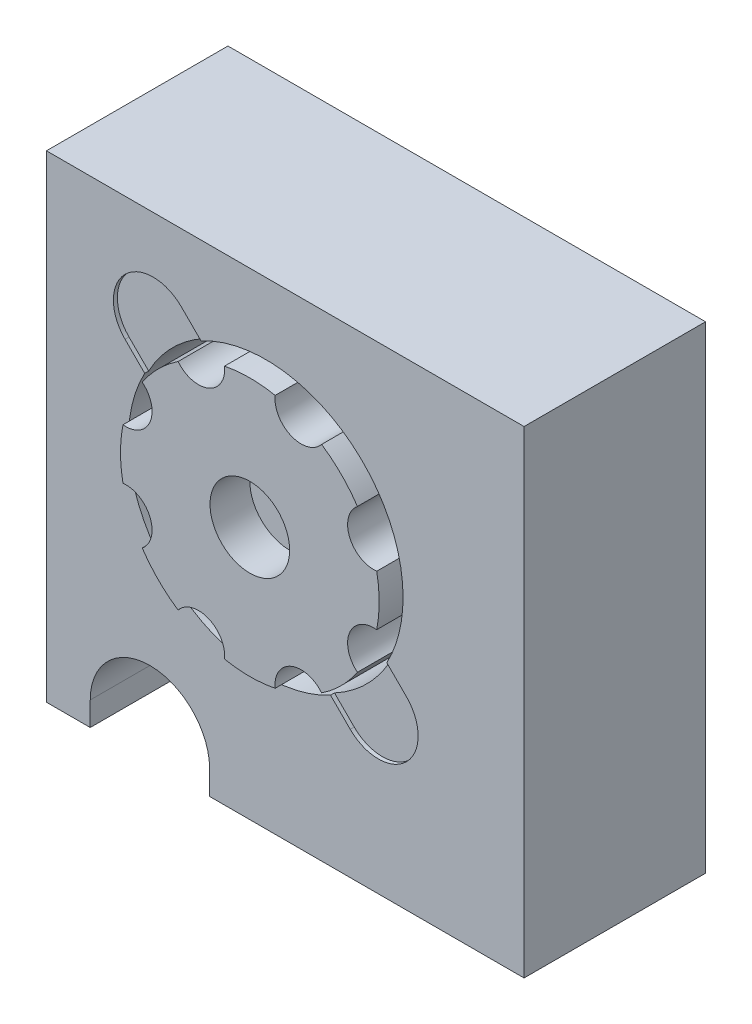
ISO-10303-21;
HEADER;
FILE_DESCRIPTION(('STEP AP214'),'2;1');
FILE_NAME('part.step','',(''),(''),'','','');
FILE_SCHEMA(('AUTOMOTIVE_DESIGN { 1 0 10303 214 1 1 1 1 }'));
ENDSEC;
DATA;
#1=APPLICATION_CONTEXT('core data for automotive mechanical design processes');
#2=APPLICATION_PROTOCOL_DEFINITION('international standard','automotive_design',2000,#1);
#3=PRODUCT_CONTEXT('',#1,'mechanical');
#4=PRODUCT('Part','Part','',(#3));
#5=PRODUCT_RELATED_PRODUCT_CATEGORY('part','',(#4));
#6=PRODUCT_DEFINITION_FORMATION('','',#4);
#7=PRODUCT_DEFINITION_CONTEXT('part definition',#1,'design');
#8=PRODUCT_DEFINITION('design','',#6,#7);
#9=PRODUCT_DEFINITION_SHAPE('','',#8);
#10=(LENGTH_UNIT() NAMED_UNIT(*) SI_UNIT(.MILLI.,.METRE.));
#11=(NAMED_UNIT(*) PLANE_ANGLE_UNIT() SI_UNIT($,.RADIAN.));
#12=(NAMED_UNIT(*) SI_UNIT($,.STERADIAN.) SOLID_ANGLE_UNIT());
#13=UNCERTAINTY_MEASURE_WITH_UNIT(LENGTH_MEASURE(1.E-05),#10,'distance_accuracy_value','');
#14=(GEOMETRIC_REPRESENTATION_CONTEXT(3) GLOBAL_UNCERTAINTY_ASSIGNED_CONTEXT((#13)) GLOBAL_UNIT_ASSIGNED_CONTEXT((#10,
#11,#12)) REPRESENTATION_CONTEXT('',''));
#15=CARTESIAN_POINT('',(0.,0.,0.));
#16=DIRECTION('',(0.,0.,1.));
#17=DIRECTION('',(1.,0.,0.));
#18=AXIS2_PLACEMENT_3D('',#15,#16,#17);
#19=CARTESIAN_POINT('',(-0.244999999999999,0.382,2.48));
#20=DIRECTION('',(0.,0.,-1.));
#21=DIRECTION('',(-1.,0.,0.));
#22=AXIS2_PLACEMENT_3D('',#19,#20,#21);
#23=CYLINDRICAL_SURFACE('',#22,1.625);
#24=CARTESIAN_POINT('',(-0.244999999999999,0.382,1.28));
#25=DIRECTION('',(0.,0.,1.));
#26=DIRECTION('',(1.,0.,0.));
#27=AXIS2_PLACEMENT_3D('',#24,#25,#26);
#28=CIRCLE('',#27,1.625);
#29=CARTESIAN_POINT('',(1.34854429100551,0.063815159688981,1.28));
#30=VERTEX_POINT('',#29);
#31=CARTESIAN_POINT('',(1.34854429100551,0.700184840311017,1.28));
#32=VERTEX_POINT('',#31);
#33=EDGE_CURVE('E273',#30,#32,#28,.T.);
#34=ORIENTED_EDGE('',*,*,#33,.T.);
#35=DIRECTION('',(0.,0.,1.));
#36=VECTOR('',#35,1.);
#37=CARTESIAN_POINT('',(1.34854429100551,0.700184840311017,1.88));
#38=LINE('',#37,#36);
#39=CARTESIAN_POINT('',(1.34854429100551,0.700184840311017,2.48));
#40=VERTEX_POINT('',#39);
#41=EDGE_CURVE('E282',#32,#40,#38,.T.);
#42=ORIENTED_EDGE('',*,*,#41,.T.);
#43=CARTESIAN_POINT('',(-0.244999999999999,0.382,2.48));
#44=DIRECTION('',(0.,0.,1.));
#45=DIRECTION('',(1.,0.,0.));
#46=AXIS2_PLACEMENT_3D('',#43,#44,#45);
#47=CIRCLE('',#46,1.625);
#48=CARTESIAN_POINT('',(1.34854429100551,0.0638151596889812,2.48));
#49=VERTEX_POINT('',#48);
#50=EDGE_CURVE('E271',#49,#40,#47,.T.);
#51=ORIENTED_EDGE('',*,*,#50,.F.);
#52=DIRECTION('',(0.,0.,1.));
#53=VECTOR('',#52,1.);
#54=CARTESIAN_POINT('',(1.34854429100551,0.063815159688981,1.88));
#55=LINE('',#54,#53);
#56=EDGE_CURVE('E50',#49,#30,#55,.F.);
#57=ORIENTED_EDGE('',*,*,#56,.T.);
#58=EDGE_LOOP('',(#34,#42,#51,#57));
#59=FACE_BOUND('',#58,.T.);
#60=ADVANCED_FACE('F35',(#59),#23,.T.);
#61=CARTESIAN_POINT('',(0.656815316036428,-0.969796632545783,1.28));
#62=VERTEX_POINT('',#61);
#63=CARTESIAN_POINT('',(1.10679663254579,-0.519815316036425,1.28));
#64=VERTEX_POINT('',#63);
#65=EDGE_CURVE('E281',#62,#64,#28,.T.);
#66=ORIENTED_EDGE('',*,*,#65,.T.);
#67=DIRECTION('',(0.,0.,1.));
#68=VECTOR('',#67,1.);
#69=CARTESIAN_POINT('',(1.10679663254579,-0.519815316036425,1.88));
#70=LINE('',#69,#68);
#71=CARTESIAN_POINT('',(1.10679663254579,-0.519815316036425,2.48));
#72=VERTEX_POINT('',#71);
#73=EDGE_CURVE('E290',#64,#72,#70,.T.);
#74=ORIENTED_EDGE('',*,*,#73,.T.);
#75=CARTESIAN_POINT('',(0.656815316036429,-0.969796632545782,2.48));
#76=VERTEX_POINT('',#75);
#77=EDGE_CURVE('E275',#76,#72,#47,.T.);
#78=ORIENTED_EDGE('',*,*,#77,.F.);
#79=DIRECTION('',(0.,0.,1.));
#80=VECTOR('',#79,1.);
#81=CARTESIAN_POINT('',(0.656815316036428,-0.969796632545783,1.88));
#82=LINE('',#81,#80);
#83=EDGE_CURVE('E58',#76,#62,#82,.F.);
#84=ORIENTED_EDGE('',*,*,#83,.T.);
#85=EDGE_LOOP('',(#66,#74,#78,#84));
#86=FACE_BOUND('',#85,.T.);
#87=ADVANCED_FACE('F385',(#86),#23,.T.);
#88=CARTESIAN_POINT('',(-0.563184840311004,-1.21154429100551,1.28));
#89=VERTEX_POINT('',#88);
#90=CARTESIAN_POINT('',(0.073184840311017,-1.21154429100551,1.28));
#91=VERTEX_POINT('',#90);
#92=EDGE_CURVE('E287',#89,#91,#28,.T.);
#93=ORIENTED_EDGE('',*,*,#92,.T.);
#94=DIRECTION('',(0.,0.,1.));
#95=VECTOR('',#94,1.);
#96=CARTESIAN_POINT('',(0.0731848403110171,-1.21154429100551,1.88));
#97=LINE('',#96,#95);
#98=CARTESIAN_POINT('',(0.0731848403110171,-1.21154429100551,2.48));
#99=VERTEX_POINT('',#98);
#100=EDGE_CURVE('E296',#91,#99,#97,.T.);
#101=ORIENTED_EDGE('',*,*,#100,.T.);
#102=CARTESIAN_POINT('',(-0.563184840311004,-1.21154429100551,2.48));
#103=VERTEX_POINT('',#102);
#104=EDGE_CURVE('E376',#103,#99,#47,.T.);
#105=ORIENTED_EDGE('',*,*,#104,.F.);
#106=DIRECTION('',(0.,0.,1.));
#107=VECTOR('',#106,1.);
#108=CARTESIAN_POINT('',(-0.563184840311004,-1.21154429100551,1.88));
#109=LINE('',#108,#107);
#110=EDGE_CURVE('E303',#103,#89,#109,.F.);
#111=ORIENTED_EDGE('',*,*,#110,.T.);
#112=EDGE_LOOP('',(#93,#101,#105,#111));
#113=FACE_BOUND('',#112,.T.);
#114=ADVANCED_FACE('F403',(#113),#23,.T.);
#115=CARTESIAN_POINT('',(-1.59679663254578,-0.519815316036427,1.28));
#116=VERTEX_POINT('',#115);
#117=CARTESIAN_POINT('',(-1.14681531603643,-0.969796632545782,1.28));
#118=VERTEX_POINT('',#117);
#119=EDGE_CURVE('E443',#116,#118,#28,.T.);
#120=ORIENTED_EDGE('',*,*,#119,.T.);
#121=DIRECTION('',(0.,0.,1.));
#122=VECTOR('',#121,1.);
#123=CARTESIAN_POINT('',(-1.14681531603643,-0.969796632545781,1.88));
#124=LINE('',#123,#122);
#125=CARTESIAN_POINT('',(-1.14681531603643,-0.969796632545781,2.48));
#126=VERTEX_POINT('',#125);
#127=EDGE_CURVE('E300',#118,#126,#124,.T.);
#128=ORIENTED_EDGE('',*,*,#127,.T.);
#129=CARTESIAN_POINT('',(-1.59679663254578,-0.519815316036428,2.48));
#130=VERTEX_POINT('',#129);
#131=EDGE_CURVE('E372',#130,#126,#47,.T.);
#132=ORIENTED_EDGE('',*,*,#131,.F.);
#133=DIRECTION('',(0.,0.,1.));
#134=VECTOR('',#133,1.);
#135=CARTESIAN_POINT('',(-1.59679663254578,-0.519815316036427,1.88));
#136=LINE('',#135,#134);
#137=EDGE_CURVE('E309',#130,#116,#136,.F.);
#138=ORIENTED_EDGE('',*,*,#137,.T.);
#139=EDGE_LOOP('',(#120,#128,#132,#138));
#140=FACE_BOUND('',#139,.T.);
#141=ADVANCED_FACE('F461',(#140),#23,.T.);
#142=CARTESIAN_POINT('',(-1.83854429100551,0.700184840311017,1.28));
#143=VERTEX_POINT('',#142);
#144=CARTESIAN_POINT('',(-1.83854429100551,0.0638151596889833,1.28));
#145=VERTEX_POINT('',#144);
#146=EDGE_CURVE('E445',#143,#145,#28,.T.);
#147=ORIENTED_EDGE('',*,*,#146,.T.);
#148=DIRECTION('',(0.,0.,1.));
#149=VECTOR('',#148,1.);
#150=CARTESIAN_POINT('',(-1.83854429100551,0.0638151596889833,1.88));
#151=LINE('',#150,#149);
#152=CARTESIAN_POINT('',(-1.83854429100551,0.0638151596889833,2.48));
#153=VERTEX_POINT('',#152);
#154=EDGE_CURVE('E306',#145,#153,#151,.T.);
#155=ORIENTED_EDGE('',*,*,#154,.T.);
#156=CARTESIAN_POINT('',(-1.83854429100551,0.700184840311017,2.48));
#157=VERTEX_POINT('',#156);
#158=EDGE_CURVE('E368',#157,#153,#47,.T.);
#159=ORIENTED_EDGE('',*,*,#158,.F.);
#160=DIRECTION('',(0.,0.,1.));
#161=VECTOR('',#160,1.);
#162=CARTESIAN_POINT('',(-1.83854429100551,0.700184840311017,1.88));
#163=LINE('',#162,#161);
#164=EDGE_CURVE('E315',#157,#143,#163,.F.);
#165=ORIENTED_EDGE('',*,*,#164,.T.);
#166=EDGE_LOOP('',(#147,#155,#159,#165));
#167=FACE_BOUND('',#166,.T.);
#168=ADVANCED_FACE('F422',(#167),#23,.T.);
#169=CARTESIAN_POINT('',(-1.14681531603643,1.73379663254578,1.28));
#170=VERTEX_POINT('',#169);
#171=CARTESIAN_POINT('',(-1.59679663254578,1.28381531603643,1.28));
#172=VERTEX_POINT('',#171);
#173=EDGE_CURVE('E278',#170,#172,#28,.T.);
#174=ORIENTED_EDGE('',*,*,#173,.T.);
#175=DIRECTION('',(0.,0.,1.));
#176=VECTOR('',#175,1.);
#177=CARTESIAN_POINT('',(-1.59679663254578,1.28381531603643,1.88));
#178=LINE('',#177,#176);
#179=CARTESIAN_POINT('',(-1.59679663254578,1.28381531603643,2.48));
#180=VERTEX_POINT('',#179);
#181=EDGE_CURVE('E312',#172,#180,#178,.T.);
#182=ORIENTED_EDGE('',*,*,#181,.T.);
#183=CARTESIAN_POINT('',(-1.14681531603643,1.73379663254578,2.48));
#184=VERTEX_POINT('',#183);
#185=EDGE_CURVE('E364',#184,#180,#47,.T.);
#186=ORIENTED_EDGE('',*,*,#185,.F.);
#187=DIRECTION('',(0.,0.,1.));
#188=VECTOR('',#187,1.);
#189=CARTESIAN_POINT('',(-1.14681531603643,1.73379663254578,1.88));
#190=LINE('',#189,#188);
#191=EDGE_CURVE('E253',#184,#170,#190,.F.);
#192=ORIENTED_EDGE('',*,*,#191,.T.);
#193=EDGE_LOOP('',(#174,#182,#186,#192));
#194=FACE_BOUND('',#193,.T.);
#195=ADVANCED_FACE('F414',(#194),#23,.T.);
#196=CARTESIAN_POINT('',(0.0731848403110171,1.97554429100551,1.28));
#197=VERTEX_POINT('',#196);
#198=CARTESIAN_POINT('',(-0.563184840311016,1.97554429100551,1.28));
#199=VERTEX_POINT('',#198);
#200=EDGE_CURVE('E265',#197,#199,#28,.T.);
#201=ORIENTED_EDGE('',*,*,#200,.T.);
#202=DIRECTION('',(0.,0.,1.));
#203=VECTOR('',#202,1.);
#204=CARTESIAN_POINT('',(-0.563184840311016,1.97554429100551,1.88));
#205=LINE('',#204,#203);
#206=CARTESIAN_POINT('',(-0.563184840311016,1.97554429100551,2.48));
#207=VERTEX_POINT('',#206);
#208=EDGE_CURVE('E318',#199,#207,#205,.T.);
#209=ORIENTED_EDGE('',*,*,#208,.T.);
#210=CARTESIAN_POINT('',(0.073184840311017,1.97554429100551,2.48));
#211=VERTEX_POINT('',#210);
#212=EDGE_CURVE('E360',#211,#207,#47,.T.);
#213=ORIENTED_EDGE('',*,*,#212,.F.);
#214=DIRECTION('',(0.,0.,1.));
#215=VECTOR('',#214,1.);
#216=CARTESIAN_POINT('',(0.0731848403110171,1.97554429100551,1.88));
#217=LINE('',#216,#215);
#218=EDGE_CURVE('E254',#211,#197,#217,.F.);
#219=ORIENTED_EDGE('',*,*,#218,.T.);
#220=EDGE_LOOP('',(#201,#209,#213,#219));
#221=FACE_BOUND('',#220,.T.);
#222=ADVANCED_FACE('F407',(#221),#23,.T.);
#223=CARTESIAN_POINT('',(3.,-3.,2.28));
#224=DIRECTION('',(-1.,0.,0.));
#225=DIRECTION('',(0.,-1.,0.));
#226=AXIS2_PLACEMENT_3D('',#223,#224,#225);
#227=PLANE('',#226);
#228=DIRECTION('',(0.,1.,0.));
#229=VECTOR('',#228,1.);
#230=CARTESIAN_POINT('',(3.,-3.,0.));
#231=LINE('',#230,#229);
#232=CARTESIAN_POINT('',(3.,-3.,0.));
#233=VERTEX_POINT('',#232);
#234=CARTESIAN_POINT('',(3.,3.,0.));
#235=VERTEX_POINT('',#234);
#236=EDGE_CURVE('E785',#233,#235,#231,.T.);
#237=ORIENTED_EDGE('',*,*,#236,.T.);
#238=DIRECTION('',(0.,0.,-1.));
#239=VECTOR('',#238,1.);
#240=CARTESIAN_POINT('',(3.,3.,2.28));
#241=LINE('',#240,#239);
#242=CARTESIAN_POINT('',(3.,3.,2.28));
#243=VERTEX_POINT('',#242);
#244=EDGE_CURVE('E780',#243,#235,#241,.T.);
#245=ORIENTED_EDGE('',*,*,#244,.F.);
#246=DIRECTION('',(0.,1.,0.));
#247=VECTOR('',#246,1.);
#248=CARTESIAN_POINT('',(3.,-3.,2.28));
#249=LINE('',#248,#247);
#250=CARTESIAN_POINT('',(3.,-3.,2.28));
#251=VERTEX_POINT('',#250);
#252=EDGE_CURVE('E795',#251,#243,#249,.T.);
#253=ORIENTED_EDGE('',*,*,#252,.F.);
#254=DIRECTION('',(0.,0.,-1.));
#255=VECTOR('',#254,1.);
#256=CARTESIAN_POINT('',(3.,-3.,2.28));
#257=LINE('',#256,#255);
#258=EDGE_CURVE('E799',#251,#233,#257,.T.);
#259=ORIENTED_EDGE('',*,*,#258,.T.);
#260=EDGE_LOOP('',(#237,#245,#253,#259));
#261=FACE_BOUND('',#260,.T.);
#262=ADVANCED_FACE('F37',(#261),#227,.F.);
#263=CARTESIAN_POINT('',(-3.,3.,2.28));
#264=DIRECTION('',(0.,-1.,0.));
#265=DIRECTION('',(1.,0.,0.));
#266=AXIS2_PLACEMENT_3D('',#263,#264,#265);
#267=PLANE('',#266);
#268=DIRECTION('',(-1.,0.,0.));
#269=VECTOR('',#268,1.);
#270=CARTESIAN_POINT('',(-3.,3.,0.));
#271=LINE('',#270,#269);
#272=CARTESIAN_POINT('',(-3.,3.,0.));
#273=VERTEX_POINT('',#272);
#274=EDGE_CURVE('E775',#235,#273,#271,.T.);
#275=ORIENTED_EDGE('',*,*,#274,.T.);
#276=DIRECTION('',(0.,0.,-1.));
#277=VECTOR('',#276,1.);
#278=CARTESIAN_POINT('',(-3.,3.,2.28));
#279=LINE('',#278,#277);
#280=CARTESIAN_POINT('',(-3.,3.,2.28));
#281=VERTEX_POINT('',#280);
#282=EDGE_CURVE('E777',#281,#273,#279,.T.);
#283=ORIENTED_EDGE('',*,*,#282,.F.);
#284=DIRECTION('',(-1.,0.,0.));
#285=VECTOR('',#284,1.);
#286=CARTESIAN_POINT('',(-3.,3.,2.28));
#287=LINE('',#286,#285);
#288=EDGE_CURVE('E847',#243,#281,#287,.T.);
#289=ORIENTED_EDGE('',*,*,#288,.F.);
#290=ORIENTED_EDGE('',*,*,#244,.T.);
#291=EDGE_LOOP('',(#275,#283,#289,#290));
#292=FACE_BOUND('',#291,.T.);
#293=ADVANCED_FACE('F420',(#292),#267,.F.);
#294=CARTESIAN_POINT('',(-3.,-3.,2.28));
#295=DIRECTION('',(1.,0.,0.));
#296=DIRECTION('',(0.,0.,-1.));
#297=AXIS2_PLACEMENT_3D('',#294,#295,#296);
#298=PLANE('',#297);
#299=DIRECTION('',(0.,-1.,0.));
#300=VECTOR('',#299,1.);
#301=CARTESIAN_POINT('',(-3.,-3.,0.));
#302=LINE('',#301,#300);
#303=CARTESIAN_POINT('',(-3.,-3.,0.));
#304=VERTEX_POINT('',#303);
#305=EDGE_CURVE('E784',#273,#304,#302,.T.);
#306=ORIENTED_EDGE('',*,*,#305,.T.);
#307=DIRECTION('',(0.,0.,-1.));
#308=VECTOR('',#307,1.);
#309=CARTESIAN_POINT('',(-3.,-3.,2.28));
#310=LINE('',#309,#308);
#311=CARTESIAN_POINT('',(-3.,-3.,2.28));
#312=VERTEX_POINT('',#311);
#313=EDGE_CURVE('E790',#312,#304,#310,.T.);
#314=ORIENTED_EDGE('',*,*,#313,.F.);
#315=DIRECTION('',(0.,-1.,0.));
#316=VECTOR('',#315,1.);
#317=CARTESIAN_POINT('',(-3.,-3.,2.28));
#318=LINE('',#317,#316);
#319=EDGE_CURVE('E789',#281,#312,#318,.T.);
#320=ORIENTED_EDGE('',*,*,#319,.F.);
#321=ORIENTED_EDGE('',*,*,#282,.T.);
#322=EDGE_LOOP('',(#306,#314,#320,#321));
#323=FACE_BOUND('',#322,.T.);
#324=ADVANCED_FACE('F540',(#323),#298,.F.);
#325=CARTESIAN_POINT('',(-3.,-3.,2.28));
#326=DIRECTION('',(0.,1.,0.));
#327=DIRECTION('',(0.,0.,1.));
#328=AXIS2_PLACEMENT_3D('',#325,#326,#327);
#329=PLANE('',#328);
#330=DIRECTION('',(1.,0.,0.));
#331=VECTOR('',#330,1.);
#332=CARTESIAN_POINT('',(-3.,-3.,2.28));
#333=LINE('',#332,#331);
#334=CARTESIAN_POINT('',(-0.949999999999999,-3.,2.28));
#335=VERTEX_POINT('',#334);
#336=EDGE_CURVE('E850',#335,#251,#333,.T.);
#337=ORIENTED_EDGE('',*,*,#336,.F.);
#338=DIRECTION('',(0.,0.,1.));
#339=VECTOR('',#338,1.);
#340=CARTESIAN_POINT('',(-0.949999999999999,-3.,1.28));
#341=LINE('',#340,#339);
#342=CARTESIAN_POINT('',(-0.949999999999999,-3.,1.28));
#343=VERTEX_POINT('',#342);
#344=EDGE_CURVE('E875',#343,#335,#341,.T.);
#345=ORIENTED_EDGE('',*,*,#344,.F.);
#346=DIRECTION('',(1.,0.,0.));
#347=VECTOR('',#346,1.);
#348=CARTESIAN_POINT('',(-2.45,-3.,1.28));
#349=LINE('',#348,#347);
#350=CARTESIAN_POINT('',(-2.45,-3.,1.28));
#351=VERTEX_POINT('',#350);
#352=EDGE_CURVE('E915',#351,#343,#349,.T.);
#353=ORIENTED_EDGE('',*,*,#352,.F.);
#354=DIRECTION('',(0.,0.,1.));
#355=VECTOR('',#354,1.);
#356=CARTESIAN_POINT('',(-2.45,-3.,1.28));
#357=LINE('',#356,#355);
#358=CARTESIAN_POINT('',(-2.45,-3.,2.28));
#359=VERTEX_POINT('',#358);
#360=EDGE_CURVE('E859',#351,#359,#357,.T.);
#361=ORIENTED_EDGE('',*,*,#360,.T.);
#362=EDGE_CURVE('E802',#312,#359,#333,.T.);
#363=ORIENTED_EDGE('',*,*,#362,.F.);
#364=ORIENTED_EDGE('',*,*,#313,.T.);
#365=DIRECTION('',(1.,0.,0.));
#366=VECTOR('',#365,1.);
#367=CARTESIAN_POINT('',(-3.,-3.,0.));
#368=LINE('',#367,#366);
#369=EDGE_CURVE('E793',#304,#233,#368,.T.);
#370=ORIENTED_EDGE('',*,*,#369,.T.);
#371=ORIENTED_EDGE('',*,*,#258,.F.);
#372=EDGE_LOOP('',(#337,#345,#353,#361,#363,#364,#370,#371));
#373=FACE_BOUND('',#372,.T.);
#374=ADVANCED_FACE('F528',(#373),#329,.F.);
#375=CARTESIAN_POINT('',(0.,0.,2.28));
#376=DIRECTION('',(0.,0.,-1.));
#377=DIRECTION('',(-1.,0.,0.));
#378=AXIS2_PLACEMENT_3D('',#375,#376,#377);
#379=PLANE('',#378);
#380=CARTESIAN_POINT('',(-0.244999999999999,0.382,2.28));
#381=DIRECTION('',(0.,0.,1.));
#382=DIRECTION('',(1.,0.,0.));
#383=AXIS2_PLACEMENT_3D('',#380,#381,#382);
#384=CIRCLE('',#383,1.725);
#385=CARTESIAN_POINT('',(-1.76594899620433,1.19584221501778,2.28));
#386=VERTEX_POINT('',#385);
#387=CARTESIAN_POINT('',(0.568842215017779,-1.13894899620433,2.28));
#388=VERTEX_POINT('',#387);
#389=EDGE_CURVE('E834',#386,#388,#384,.T.);
#390=ORIENTED_EDGE('',*,*,#389,.F.);
#391=DIRECTION('',(0.707106781186546,-0.707106781186549,0.));
#392=VECTOR('',#391,1.);
#393=CARTESIAN_POINT('',(0.815660171779821,-1.38576695296637,2.28));
#394=LINE('',#393,#392);
#395=CARTESIAN_POINT('',(-2.01276695296636,1.44266017177982,2.28));
#396=VERTEX_POINT('',#395);
#397=EDGE_CURVE('E885',#396,#386,#394,.T.);
#398=ORIENTED_EDGE('',*,*,#397,.F.);
#399=CARTESIAN_POINT('',(-1.65921356237309,1.7962135623731,2.28));
#400=DIRECTION('',(0.,0.,1.));
#401=DIRECTION('',(-1.,0.,0.));
#402=AXIS2_PLACEMENT_3D('',#399,#400,#401);
#403=CIRCLE('',#402,0.5);
#404=CARTESIAN_POINT('',(-1.30566017177982,2.14976695296637,2.28));
#405=VERTEX_POINT('',#404);
#406=EDGE_CURVE('E895',#405,#396,#403,.T.);
#407=ORIENTED_EDGE('',*,*,#406,.F.);
#408=DIRECTION('',(-0.707106781186546,0.707106781186549,0.));
#409=VECTOR('',#408,1.);
#410=CARTESIAN_POINT('',(1.52276695296637,-0.678660171779826,2.28));
#411=LINE('',#410,#409);
#412=CARTESIAN_POINT('',(-1.05884221501778,1.90294899620433,2.28));
#413=VERTEX_POINT('',#412);
#414=EDGE_CURVE('E892',#413,#405,#411,.T.);
#415=ORIENTED_EDGE('',*,*,#414,.F.);
#416=CARTESIAN_POINT('',(1.27594899620433,-0.431842215017783,2.28));
#417=VERTEX_POINT('',#416);
#418=EDGE_CURVE('E839',#417,#413,#384,.T.);
#419=ORIENTED_EDGE('',*,*,#418,.F.);
#420=CARTESIAN_POINT('',(1.52276695296637,-0.678660171779826,2.28));
#421=VERTEX_POINT('',#420);
#422=EDGE_CURVE('E893',#421,#417,#411,.T.);
#423=ORIENTED_EDGE('',*,*,#422,.F.);
#424=CARTESIAN_POINT('',(1.1692135623731,-1.0322135623731,2.28));
#425=DIRECTION('',(0.,0.,1.));
#426=DIRECTION('',(1.,0.,0.));
#427=AXIS2_PLACEMENT_3D('',#424,#425,#426);
#428=CIRCLE('',#427,0.5);
#429=CARTESIAN_POINT('',(0.815660171779821,-1.38576695296637,2.28));
#430=VERTEX_POINT('',#429);
#431=EDGE_CURVE('E874',#430,#421,#428,.T.);
#432=ORIENTED_EDGE('',*,*,#431,.F.);
#433=EDGE_CURVE('E898',#388,#430,#394,.T.);
#434=ORIENTED_EDGE('',*,*,#433,.F.);
#435=EDGE_LOOP('',(#390,#398,#407,#415,#419,#423,#432,#434));
#436=FACE_BOUND('',#435,.T.);
#437=CARTESIAN_POINT('',(-1.7,-2.7,2.28));
#438=DIRECTION('',(0.,0.,1.));
#439=DIRECTION('',(1.,0.,0.));
#440=AXIS2_PLACEMENT_3D('',#437,#438,#439);
#441=CIRCLE('',#440,0.75);
#442=CARTESIAN_POINT('',(-0.949999999999999,-2.7,2.28));
#443=VERTEX_POINT('',#442);
#444=CARTESIAN_POINT('',(-2.45,-2.7,2.28));
#445=VERTEX_POINT('',#444);
#446=EDGE_CURVE('E359',#443,#445,#441,.T.);
#447=ORIENTED_EDGE('',*,*,#446,.F.);
#448=DIRECTION('',(0.,1.,0.));
#449=VECTOR('',#448,1.);
#450=CARTESIAN_POINT('',(-0.949999999999999,-3.,2.28));
#451=LINE('',#450,#449);
#452=EDGE_CURVE('E865',#335,#443,#451,.T.);
#453=ORIENTED_EDGE('',*,*,#452,.F.);
#454=ORIENTED_EDGE('',*,*,#336,.T.);
#455=ORIENTED_EDGE('',*,*,#252,.T.);
#456=ORIENTED_EDGE('',*,*,#288,.T.);
#457=ORIENTED_EDGE('',*,*,#319,.T.);
#458=ORIENTED_EDGE('',*,*,#362,.T.);
#459=DIRECTION('',(0.,-1.,0.));
#460=VECTOR('',#459,1.);
#461=CARTESIAN_POINT('',(-2.45,-2.7,2.28));
#462=LINE('',#461,#460);
#463=EDGE_CURVE('E361',#445,#359,#462,.T.);
#464=ORIENTED_EDGE('',*,*,#463,.F.);
#465=EDGE_LOOP('',(#447,#453,#454,#455,#456,#457,#458,#464));
#466=FACE_BOUND('',#465,.T.);
#467=ADVANCED_FACE('F522',(#436,#466),#379,.F.);
#468=CARTESIAN_POINT('',(0.,0.,0.));
#469=DIRECTION('',(0.,0.,-1.));
#470=DIRECTION('',(-1.,0.,0.));
#471=AXIS2_PLACEMENT_3D('',#468,#469,#470);
#472=PLANE('',#471);
#473=ORIENTED_EDGE('',*,*,#236,.F.);
#474=ORIENTED_EDGE('',*,*,#369,.F.);
#475=ORIENTED_EDGE('',*,*,#305,.F.);
#476=ORIENTED_EDGE('',*,*,#274,.F.);
#477=EDGE_LOOP('',(#473,#474,#475,#476));
#478=FACE_BOUND('',#477,.T.);
#479=ADVANCED_FACE('F527',(#478),#472,.T.);
#480=CARTESIAN_POINT('',(-0.244999999999999,0.382,1.28));
#481=DIRECTION('',(0.,0.,1.));
#482=DIRECTION('',(1.,0.,0.));
#483=AXIS2_PLACEMENT_3D('',#480,#481,#482);
#484=CYLINDRICAL_SURFACE('',#483,1.725);
#485=ORIENTED_EDGE('',*,*,#389,.T.);
#486=DIRECTION('',(0.,0.,1.));
#487=VECTOR('',#486,1.);
#488=CARTESIAN_POINT('',(0.568842215017779,-1.13894899620433,1.28));
#489=LINE('',#488,#487);
#490=CARTESIAN_POINT('',(0.568842215017779,-1.13894899620433,2.23));
#491=VERTEX_POINT('',#490);
#492=EDGE_CURVE('E425',#388,#491,#489,.F.);
#493=ORIENTED_EDGE('',*,*,#492,.T.);
#494=CARTESIAN_POINT('',(-0.244999999999999,0.382,2.23));
#495=DIRECTION('',(0.,0.,1.));
#496=DIRECTION('',(1.,0.,0.));
#497=AXIS2_PLACEMENT_3D('',#494,#495,#496);
#498=CIRCLE('',#497,1.725);
#499=CARTESIAN_POINT('',(1.27594899620433,-0.431842215017783,2.23));
#500=VERTEX_POINT('',#499);
#501=EDGE_CURVE('E808',#500,#491,#498,.F.);
#502=ORIENTED_EDGE('',*,*,#501,.F.);
#503=DIRECTION('',(0.,0.,1.));
#504=VECTOR('',#503,1.);
#505=CARTESIAN_POINT('',(1.27594899620433,-0.431842215017783,1.28));
#506=LINE('',#505,#504);
#507=EDGE_CURVE('E430',#500,#417,#506,.T.);
#508=ORIENTED_EDGE('',*,*,#507,.T.);
#509=ORIENTED_EDGE('',*,*,#418,.T.);
#510=DIRECTION('',(0.,0.,1.));
#511=VECTOR('',#510,1.);
#512=CARTESIAN_POINT('',(-1.05884221501778,1.90294899620433,1.28));
#513=LINE('',#512,#511);
#514=CARTESIAN_POINT('',(-1.05884221501778,1.90294899620433,2.23));
#515=VERTEX_POINT('',#514);
#516=EDGE_CURVE('E807',#413,#515,#513,.F.);
#517=ORIENTED_EDGE('',*,*,#516,.T.);
#518=CARTESIAN_POINT('',(-1.76594899620433,1.19584221501778,2.23));
#519=VERTEX_POINT('',#518);
#520=EDGE_CURVE('E805',#519,#515,#498,.F.);
#521=ORIENTED_EDGE('',*,*,#520,.F.);
#522=DIRECTION('',(0.,0.,1.));
#523=VECTOR('',#522,1.);
#524=CARTESIAN_POINT('',(-1.76594899620433,1.19584221501778,1.28));
#525=LINE('',#524,#523);
#526=EDGE_CURVE('E811',#519,#386,#525,.T.);
#527=ORIENTED_EDGE('',*,*,#526,.T.);
#528=EDGE_LOOP('',(#485,#493,#502,#508,#509,#517,#521,#527));
#529=FACE_BOUND('',#528,.T.);
#530=CARTESIAN_POINT('',(-0.244999999999999,0.382,1.28));
#531=DIRECTION('',(0.,0.,1.));
#532=DIRECTION('',(1.,0.,0.));
#533=AXIS2_PLACEMENT_3D('',#530,#531,#532);
#534=CIRCLE('',#533,1.725);
#535=CARTESIAN_POINT('',(1.48,0.382,1.28));
#536=VERTEX_POINT('',#535);
#537=EDGE_CURVE('E838',#536,#536,#534,.T.);
#538=ORIENTED_EDGE('',*,*,#537,.F.);
#539=EDGE_LOOP('',(#538));
#540=FACE_BOUND('',#539,.T.);
#541=ADVANCED_FACE('F624',(#529,#540),#484,.F.);
#542=CARTESIAN_POINT('',(-0.244999999999999,0.382,1.28));
#543=DIRECTION('',(0.,0.,1.));
#544=DIRECTION('',(1.,0.,0.));
#545=AXIS2_PLACEMENT_3D('',#542,#543,#544);
#546=PLANE('',#545);
#547=CARTESIAN_POINT('',(1.10679663254578,1.28381531603643,1.28));
#548=VERTEX_POINT('',#547);
#549=CARTESIAN_POINT('',(0.656815316036428,1.73379663254578,1.28));
#550=VERTEX_POINT('',#549);
#551=EDGE_CURVE('E262',#548,#550,#28,.T.);
#552=ORIENTED_EDGE('',*,*,#551,.F.);
#553=CARTESIAN_POINT('',(1.3119975971637,1.02692952132753,1.28));
#554=DIRECTION('',(0.,0.,1.));
#555=DIRECTION('',(1.,0.,0.));
#556=AXIS2_PLACEMENT_3D('',#553,#554,#555);
#557=CIRCLE('',#556,0.328782218806535);
#558=EDGE_CURVE('E266',#32,#548,#557,.F.);
#559=ORIENTED_EDGE('',*,*,#558,.F.);
#560=ORIENTED_EDGE('',*,*,#33,.F.);
#561=CARTESIAN_POINT('',(1.31199759716371,-0.262929521327531,1.28));
#562=DIRECTION('',(0.,0.,1.));
#563=DIRECTION('',(1.,0.,0.));
#564=AXIS2_PLACEMENT_3D('',#561,#562,#563);
#565=CIRCLE('',#564,0.328782218806535);
#566=EDGE_CURVE('E329',#64,#30,#565,.F.);
#567=ORIENTED_EDGE('',*,*,#566,.F.);
#568=ORIENTED_EDGE('',*,*,#65,.F.);
#569=CARTESIAN_POINT('',(0.399929521327528,-1.1749975971637,1.28));
#570=DIRECTION('',(0.,0.,1.));
#571=DIRECTION('',(1.,0.,0.));
#572=AXIS2_PLACEMENT_3D('',#569,#570,#571);
#573=CIRCLE('',#572,0.328782218806535);
#574=EDGE_CURVE('E326',#91,#62,#573,.F.);
#575=ORIENTED_EDGE('',*,*,#574,.F.);
#576=ORIENTED_EDGE('',*,*,#92,.F.);
#577=CARTESIAN_POINT('',(-0.889929521327507,-1.17499759716367,1.28));
#578=DIRECTION('',(0.,0.,1.));
#579=DIRECTION('',(1.,0.,0.));
#580=AXIS2_PLACEMENT_3D('',#577,#578,#579);
#581=CIRCLE('',#580,0.328782218806531);
#582=EDGE_CURVE('E324',#118,#89,#581,.F.);
#583=ORIENTED_EDGE('',*,*,#582,.F.);
#584=ORIENTED_EDGE('',*,*,#119,.F.);
#585=CARTESIAN_POINT('',(-1.8019975971637,-0.262929521327528,1.28));
#586=DIRECTION('',(0.,0.,1.));
#587=DIRECTION('',(1.,0.,0.));
#588=AXIS2_PLACEMENT_3D('',#585,#586,#587);
#589=CIRCLE('',#588,0.328782218806535);
#590=EDGE_CURVE('E327',#145,#116,#589,.F.);
#591=ORIENTED_EDGE('',*,*,#590,.F.);
#592=ORIENTED_EDGE('',*,*,#146,.F.);
#593=CARTESIAN_POINT('',(-1.8019975971637,1.02692952132753,1.28));
#594=DIRECTION('',(0.,0.,1.));
#595=DIRECTION('',(1.,0.,0.));
#596=AXIS2_PLACEMENT_3D('',#593,#594,#595);
#597=CIRCLE('',#596,0.328782218806535);
#598=EDGE_CURVE('E334',#172,#143,#597,.F.);
#599=ORIENTED_EDGE('',*,*,#598,.F.);
#600=ORIENTED_EDGE('',*,*,#173,.F.);
#601=CARTESIAN_POINT('',(-0.889929521327527,1.9389975971637,1.28));
#602=DIRECTION('',(0.,0.,1.));
#603=DIRECTION('',(1.,0.,0.));
#604=AXIS2_PLACEMENT_3D('',#601,#602,#603);
#605=CIRCLE('',#604,0.328782218806535);
#606=EDGE_CURVE('E332',#199,#170,#605,.F.);
#607=ORIENTED_EDGE('',*,*,#606,.F.);
#608=ORIENTED_EDGE('',*,*,#200,.F.);
#609=CARTESIAN_POINT('',(0.399929521327528,1.9389975971637,1.28));
#610=DIRECTION('',(0.,0.,1.));
#611=DIRECTION('',(1.,0.,0.));
#612=AXIS2_PLACEMENT_3D('',#609,#610,#611);
#613=CIRCLE('',#612,0.328782218806535);
#614=EDGE_CURVE('E245',#550,#197,#613,.F.);
#615=ORIENTED_EDGE('',*,*,#614,.F.);
#616=EDGE_LOOP('',(#552,#559,#560,#567,#568,#575,#576,#583,#584,#591,#592,#599,#600,#607,#608,#615));
#617=FACE_BOUND('',#616,.T.);
#618=ORIENTED_EDGE('',*,*,#537,.T.);
#619=EDGE_LOOP('',(#618));
#620=FACE_BOUND('',#619,.T.);
#621=ADVANCED_FACE('F259',(#617,#620),#546,.T.);
#622=CARTESIAN_POINT('',(1.1692135623731,-1.0322135623731,2.23));
#623=DIRECTION('',(0.,0.,1.));
#624=DIRECTION('',(1.,0.,0.));
#625=AXIS2_PLACEMENT_3D('',#622,#623,#624);
#626=PLANE('',#625);
#627=ORIENTED_EDGE('',*,*,#520,.T.);
#628=DIRECTION('',(-0.707106781186546,0.707106781186549,0.));
#629=VECTOR('',#628,1.);
#630=CARTESIAN_POINT('',(1.52276695296637,-0.678660171779826,2.23));
#631=LINE('',#630,#629);
#632=CARTESIAN_POINT('',(-1.30566017177982,2.14976695296637,2.23));
#633=VERTEX_POINT('',#632);
#634=EDGE_CURVE('E884',#515,#633,#631,.T.);
#635=ORIENTED_EDGE('',*,*,#634,.T.);
#636=CARTESIAN_POINT('',(-1.65921356237309,1.7962135623731,2.23));
#637=DIRECTION('',(0.,0.,1.));
#638=DIRECTION('',(-1.,0.,0.));
#639=AXIS2_PLACEMENT_3D('',#636,#637,#638);
#640=CIRCLE('',#639,0.5);
#641=CARTESIAN_POINT('',(-2.01276695296636,1.44266017177982,2.23));
#642=VERTEX_POINT('',#641);
#643=EDGE_CURVE('E829',#633,#642,#640,.T.);
#644=ORIENTED_EDGE('',*,*,#643,.T.);
#645=DIRECTION('',(0.707106781186546,-0.707106781186549,0.));
#646=VECTOR('',#645,1.);
#647=CARTESIAN_POINT('',(0.815660171779821,-1.38576695296637,2.23));
#648=LINE('',#647,#646);
#649=EDGE_CURVE('E828',#642,#519,#648,.T.);
#650=ORIENTED_EDGE('',*,*,#649,.T.);
#651=EDGE_LOOP('',(#627,#635,#644,#650));
#652=FACE_BOUND('',#651,.T.);
#653=ADVANCED_FACE('F563',(#652),#626,.T.);
#654=CARTESIAN_POINT('',(1.52276695296637,-0.678660171779826,2.23));
#655=DIRECTION('',(0.707106781186549,0.707106781186546,0.));
#656=DIRECTION('',(-0.707106781186546,0.707106781186549,0.));
#657=AXIS2_PLACEMENT_3D('',#654,#655,#656);
#658=PLANE('',#657);
#659=ORIENTED_EDGE('',*,*,#414,.T.);
#660=DIRECTION('',(0.,0.,1.));
#661=VECTOR('',#660,1.);
#662=CARTESIAN_POINT('',(-1.30566017177982,2.14976695296637,2.23));
#663=LINE('',#662,#661);
#664=EDGE_CURVE('E903',#633,#405,#663,.T.);
#665=ORIENTED_EDGE('',*,*,#664,.F.);
#666=ORIENTED_EDGE('',*,*,#634,.F.);
#667=ORIENTED_EDGE('',*,*,#516,.F.);
#668=EDGE_LOOP('',(#659,#665,#666,#667));
#669=FACE_BOUND('',#668,.T.);
#670=ADVANCED_FACE('F574',(#669),#658,.F.);
#671=CARTESIAN_POINT('',(0.815660171779821,-1.38576695296637,2.23));
#672=DIRECTION('',(-0.707106781186549,-0.707106781186546,0.));
#673=DIRECTION('',(0.707106781186546,-0.707106781186549,0.));
#674=AXIS2_PLACEMENT_3D('',#671,#672,#673);
#675=PLANE('',#674);
#676=ORIENTED_EDGE('',*,*,#649,.F.);
#677=DIRECTION('',(0.,0.,1.));
#678=VECTOR('',#677,1.);
#679=CARTESIAN_POINT('',(-2.01276695296636,1.44266017177982,2.23));
#680=LINE('',#679,#678);
#681=EDGE_CURVE('E901',#642,#396,#680,.T.);
#682=ORIENTED_EDGE('',*,*,#681,.T.);
#683=ORIENTED_EDGE('',*,*,#397,.T.);
#684=ORIENTED_EDGE('',*,*,#526,.F.);
#685=EDGE_LOOP('',(#676,#682,#683,#684));
#686=FACE_BOUND('',#685,.T.);
#687=ADVANCED_FACE('F585',(#686),#675,.F.);
#688=CARTESIAN_POINT('',(-1.65921356237309,1.7962135623731,2.23));
#689=DIRECTION('',(0.,0.,1.));
#690=DIRECTION('',(1.,0.,0.));
#691=AXIS2_PLACEMENT_3D('',#688,#689,#690);
#692=CYLINDRICAL_SURFACE('',#691,0.5);
#693=ORIENTED_EDGE('',*,*,#406,.T.);
#694=ORIENTED_EDGE('',*,*,#681,.F.);
#695=ORIENTED_EDGE('',*,*,#643,.F.);
#696=ORIENTED_EDGE('',*,*,#664,.T.);
#697=EDGE_LOOP('',(#693,#694,#695,#696));
#698=FACE_BOUND('',#697,.T.);
#699=ADVANCED_FACE('F582',(#698),#692,.F.);
#700=ORIENTED_EDGE('',*,*,#433,.T.);
#701=DIRECTION('',(0.,0.,1.));
#702=VECTOR('',#701,1.);
#703=CARTESIAN_POINT('',(0.815660171779821,-1.38576695296637,2.23));
#704=LINE('',#703,#702);
#705=CARTESIAN_POINT('',(0.815660171779821,-1.38576695296637,2.23));
#706=VERTEX_POINT('',#705);
#707=EDGE_CURVE('E826',#706,#430,#704,.T.);
#708=ORIENTED_EDGE('',*,*,#707,.F.);
#709=EDGE_CURVE('E820',#491,#706,#648,.T.);
#710=ORIENTED_EDGE('',*,*,#709,.F.);
#711=ORIENTED_EDGE('',*,*,#492,.F.);
#712=EDGE_LOOP('',(#700,#708,#710,#711));
#713=FACE_BOUND('',#712,.T.);
#714=ADVANCED_FACE('F571',(#713),#675,.F.);
#715=CARTESIAN_POINT('',(1.52276695296637,-0.678660171779826,2.23));
#716=VERTEX_POINT('',#715);
#717=EDGE_CURVE('E823',#716,#500,#631,.T.);
#718=ORIENTED_EDGE('',*,*,#717,.F.);
#719=DIRECTION('',(0.,0.,1.));
#720=VECTOR('',#719,1.);
#721=CARTESIAN_POINT('',(1.52276695296637,-0.678660171779826,2.23));
#722=LINE('',#721,#720);
#723=EDGE_CURVE('E889',#716,#421,#722,.T.);
#724=ORIENTED_EDGE('',*,*,#723,.T.);
#725=ORIENTED_EDGE('',*,*,#422,.T.);
#726=ORIENTED_EDGE('',*,*,#507,.F.);
#727=EDGE_LOOP('',(#718,#724,#725,#726));
#728=FACE_BOUND('',#727,.T.);
#729=ADVANCED_FACE('F560',(#728),#658,.F.);
#730=ORIENTED_EDGE('',*,*,#501,.T.);
#731=ORIENTED_EDGE('',*,*,#709,.T.);
#732=CARTESIAN_POINT('',(1.1692135623731,-1.0322135623731,2.23));
#733=DIRECTION('',(0.,0.,1.));
#734=DIRECTION('',(1.,0.,0.));
#735=AXIS2_PLACEMENT_3D('',#732,#733,#734);
#736=CIRCLE('',#735,0.5);
#737=EDGE_CURVE('E882',#706,#716,#736,.T.);
#738=ORIENTED_EDGE('',*,*,#737,.T.);
#739=ORIENTED_EDGE('',*,*,#717,.T.);
#740=EDGE_LOOP('',(#730,#731,#738,#739));
#741=FACE_BOUND('',#740,.T.);
#742=ADVANCED_FACE('F550',(#741),#626,.T.);
#743=CARTESIAN_POINT('',(1.1692135623731,-1.0322135623731,2.23));
#744=DIRECTION('',(0.,0.,1.));
#745=DIRECTION('',(1.,0.,0.));
#746=AXIS2_PLACEMENT_3D('',#743,#744,#745);
#747=CYLINDRICAL_SURFACE('',#746,0.5);
#748=ORIENTED_EDGE('',*,*,#431,.T.);
#749=ORIENTED_EDGE('',*,*,#723,.F.);
#750=ORIENTED_EDGE('',*,*,#737,.F.);
#751=ORIENTED_EDGE('',*,*,#707,.T.);
#752=EDGE_LOOP('',(#748,#749,#750,#751));
#753=FACE_BOUND('',#752,.T.);
#754=ADVANCED_FACE('F514',(#753),#747,.F.);
#755=CARTESIAN_POINT('',(-1.7,-2.7,1.28));
#756=DIRECTION('',(0.,0.,1.));
#757=DIRECTION('',(1.,0.,0.));
#758=AXIS2_PLACEMENT_3D('',#755,#756,#757);
#759=CYLINDRICAL_SURFACE('',#758,0.75);
#760=ORIENTED_EDGE('',*,*,#446,.T.);
#761=DIRECTION('',(0.,0.,1.));
#762=VECTOR('',#761,1.);
#763=CARTESIAN_POINT('',(-2.45,-2.7,1.28));
#764=LINE('',#763,#762);
#765=CARTESIAN_POINT('',(-2.45,-2.7,1.28));
#766=VERTEX_POINT('',#765);
#767=EDGE_CURVE('E878',#766,#445,#764,.T.);
#768=ORIENTED_EDGE('',*,*,#767,.F.);
#769=CARTESIAN_POINT('',(-1.7,-2.7,1.28));
#770=DIRECTION('',(0.,0.,1.));
#771=DIRECTION('',(1.,0.,0.));
#772=AXIS2_PLACEMENT_3D('',#769,#770,#771);
#773=CIRCLE('',#772,0.75);
#774=CARTESIAN_POINT('',(-0.949999999999999,-2.7,1.28));
#775=VERTEX_POINT('',#774);
#776=EDGE_CURVE('E866',#775,#766,#773,.T.);
#777=ORIENTED_EDGE('',*,*,#776,.F.);
#778=DIRECTION('',(0.,0.,1.));
#779=VECTOR('',#778,1.);
#780=CARTESIAN_POINT('',(-0.949999999999999,-2.7,1.28));
#781=LINE('',#780,#779);
#782=EDGE_CURVE('E872',#775,#443,#781,.T.);
#783=ORIENTED_EDGE('',*,*,#782,.T.);
#784=EDGE_LOOP('',(#760,#768,#777,#783));
#785=FACE_BOUND('',#784,.T.);
#786=ADVANCED_FACE('F504',(#785),#759,.F.);
#787=CARTESIAN_POINT('',(-0.949999999999999,-3.,1.28));
#788=DIRECTION('',(1.,0.,0.));
#789=DIRECTION('',(0.,1.,0.));
#790=AXIS2_PLACEMENT_3D('',#787,#788,#789);
#791=PLANE('',#790);
#792=ORIENTED_EDGE('',*,*,#452,.T.);
#793=ORIENTED_EDGE('',*,*,#782,.F.);
#794=DIRECTION('',(0.,1.,0.));
#795=VECTOR('',#794,1.);
#796=CARTESIAN_POINT('',(-0.949999999999999,-3.,1.28));
#797=LINE('',#796,#795);
#798=EDGE_CURVE('E881',#343,#775,#797,.T.);
#799=ORIENTED_EDGE('',*,*,#798,.F.);
#800=ORIENTED_EDGE('',*,*,#344,.T.);
#801=EDGE_LOOP('',(#792,#793,#799,#800));
#802=FACE_BOUND('',#801,.T.);
#803=ADVANCED_FACE('F494',(#802),#791,.F.);
#804=CARTESIAN_POINT('',(-2.45,-2.7,1.28));
#805=DIRECTION('',(-1.,0.,0.));
#806=DIRECTION('',(0.,0.,1.));
#807=AXIS2_PLACEMENT_3D('',#804,#805,#806);
#808=PLANE('',#807);
#809=ORIENTED_EDGE('',*,*,#463,.T.);
#810=ORIENTED_EDGE('',*,*,#360,.F.);
#811=DIRECTION('',(0.,-1.,0.));
#812=VECTOR('',#811,1.);
#813=CARTESIAN_POINT('',(-2.45,-2.7,1.28));
#814=LINE('',#813,#812);
#815=EDGE_CURVE('E869',#766,#351,#814,.T.);
#816=ORIENTED_EDGE('',*,*,#815,.F.);
#817=ORIENTED_EDGE('',*,*,#767,.T.);
#818=EDGE_LOOP('',(#809,#810,#816,#817));
#819=FACE_BOUND('',#818,.T.);
#820=ADVANCED_FACE('F411',(#819),#808,.F.);
#821=CARTESIAN_POINT('',(-1.7,-2.7,1.28));
#822=DIRECTION('',(0.,0.,1.));
#823=DIRECTION('',(1.,0.,0.));
#824=AXIS2_PLACEMENT_3D('',#821,#822,#823);
#825=PLANE('',#824);
#826=ORIENTED_EDGE('',*,*,#776,.T.);
#827=ORIENTED_EDGE('',*,*,#815,.T.);
#828=ORIENTED_EDGE('',*,*,#352,.T.);
#829=ORIENTED_EDGE('',*,*,#798,.T.);
#830=EDGE_LOOP('',(#826,#827,#828,#829));
#831=FACE_BOUND('',#830,.T.);
#832=ADVANCED_FACE('F406',(#831),#825,.T.);
#833=CARTESIAN_POINT('',(1.10679663254578,1.28381531603643,2.48));
#834=VERTEX_POINT('',#833);
#835=CARTESIAN_POINT('',(0.656815316036428,1.73379663254578,2.48));
#836=VERTEX_POINT('',#835);
#837=EDGE_CURVE('E277',#834,#836,#47,.T.);
#838=ORIENTED_EDGE('',*,*,#837,.F.);
#839=DIRECTION('',(0.,0.,1.));
#840=VECTOR('',#839,1.);
#841=CARTESIAN_POINT('',(1.10679663254578,1.28381531603643,1.88));
#842=LINE('',#841,#840);
#843=EDGE_CURVE('E270',#834,#548,#842,.F.);
#844=ORIENTED_EDGE('',*,*,#843,.T.);
#845=ORIENTED_EDGE('',*,*,#551,.T.);
#846=DIRECTION('',(0.,0.,1.));
#847=VECTOR('',#846,1.);
#848=CARTESIAN_POINT('',(0.656815316036428,1.73379663254578,1.88));
#849=LINE('',#848,#847);
#850=EDGE_CURVE('E242',#550,#836,#849,.T.);
#851=ORIENTED_EDGE('',*,*,#850,.T.);
#852=EDGE_LOOP('',(#838,#844,#845,#851));
#853=FACE_BOUND('',#852,.T.);
#854=ADVANCED_FACE('F269',(#853),#23,.T.);
#855=CARTESIAN_POINT('',(-0.244999999999999,0.382,2.48));
#856=DIRECTION('',(0.,0.,1.));
#857=DIRECTION('',(1.,0.,0.));
#858=AXIS2_PLACEMENT_3D('',#855,#856,#857);
#859=PLANE('',#858);
#860=CARTESIAN_POINT('',(-0.244999999999999,0.382,2.48));
#861=DIRECTION('',(0.,0.,1.));
#862=DIRECTION('',(1.,0.,0.));
#863=AXIS2_PLACEMENT_3D('',#860,#861,#862);
#864=CIRCLE('',#863,0.5);
#865=CARTESIAN_POINT('',(0.255000000000001,0.382,2.48));
#866=VERTEX_POINT('',#865);
#867=EDGE_CURVE('E338',#866,#866,#864,.T.);
#868=ORIENTED_EDGE('',*,*,#867,.F.);
#869=EDGE_LOOP('',(#868));
#870=FACE_BOUND('',#869,.T.);
#871=CARTESIAN_POINT('',(1.3119975971637,1.02692952132753,2.48));
#872=DIRECTION('',(0.,0.,1.));
#873=DIRECTION('',(1.,0.,0.));
#874=AXIS2_PLACEMENT_3D('',#871,#872,#873);
#875=CIRCLE('',#874,0.328782218806535);
#876=EDGE_CURVE('E11',#834,#40,#875,.T.);
#877=ORIENTED_EDGE('',*,*,#876,.F.);
#878=ORIENTED_EDGE('',*,*,#837,.T.);
#879=CARTESIAN_POINT('',(0.399929521327528,1.9389975971637,2.48));
#880=DIRECTION('',(0.,0.,1.));
#881=DIRECTION('',(1.,0.,0.));
#882=AXIS2_PLACEMENT_3D('',#879,#880,#881);
#883=CIRCLE('',#882,0.328782218806535);
#884=EDGE_CURVE('E248',#211,#836,#883,.T.);
#885=ORIENTED_EDGE('',*,*,#884,.F.);
#886=ORIENTED_EDGE('',*,*,#212,.T.);
#887=CARTESIAN_POINT('',(-0.889929521327527,1.9389975971637,2.48));
#888=DIRECTION('',(0.,0.,1.));
#889=DIRECTION('',(1.,0.,0.));
#890=AXIS2_PLACEMENT_3D('',#887,#888,#889);
#891=CIRCLE('',#890,0.328782218806535);
#892=EDGE_CURVE('E424',#184,#207,#891,.T.);
#893=ORIENTED_EDGE('',*,*,#892,.F.);
#894=ORIENTED_EDGE('',*,*,#185,.T.);
#895=CARTESIAN_POINT('',(-1.8019975971637,1.02692952132753,2.48));
#896=DIRECTION('',(0.,0.,1.));
#897=DIRECTION('',(1.,0.,0.));
#898=AXIS2_PLACEMENT_3D('',#895,#896,#897);
#899=CIRCLE('',#898,0.328782218806535);
#900=EDGE_CURVE('E427',#157,#180,#899,.T.);
#901=ORIENTED_EDGE('',*,*,#900,.F.);
#902=ORIENTED_EDGE('',*,*,#158,.T.);
#903=CARTESIAN_POINT('',(-1.8019975971637,-0.262929521327528,2.48));
#904=DIRECTION('',(0.,0.,1.));
#905=DIRECTION('',(1.,0.,0.));
#906=AXIS2_PLACEMENT_3D('',#903,#904,#905);
#907=CIRCLE('',#906,0.328782218806535);
#908=EDGE_CURVE('E435',#130,#153,#907,.T.);
#909=ORIENTED_EDGE('',*,*,#908,.F.);
#910=ORIENTED_EDGE('',*,*,#131,.T.);
#911=CARTESIAN_POINT('',(-0.889929521327507,-1.17499759716367,2.48));
#912=DIRECTION('',(0.,0.,1.));
#913=DIRECTION('',(1.,0.,0.));
#914=AXIS2_PLACEMENT_3D('',#911,#912,#913);
#915=CIRCLE('',#914,0.328782218806531);
#916=EDGE_CURVE('E437',#103,#126,#915,.T.);
#917=ORIENTED_EDGE('',*,*,#916,.F.);
#918=ORIENTED_EDGE('',*,*,#104,.T.);
#919=CARTESIAN_POINT('',(0.399929521327528,-1.1749975971637,2.48));
#920=DIRECTION('',(0.,0.,1.));
#921=DIRECTION('',(1.,0.,0.));
#922=AXIS2_PLACEMENT_3D('',#919,#920,#921);
#923=CIRCLE('',#922,0.328782218806535);
#924=EDGE_CURVE('E383',#76,#99,#923,.T.);
#925=ORIENTED_EDGE('',*,*,#924,.F.);
#926=ORIENTED_EDGE('',*,*,#77,.T.);
#927=CARTESIAN_POINT('',(1.31199759716371,-0.262929521327531,2.48));
#928=DIRECTION('',(0.,0.,1.));
#929=DIRECTION('',(1.,0.,0.));
#930=AXIS2_PLACEMENT_3D('',#927,#928,#929);
#931=CIRCLE('',#930,0.328782218806535);
#932=EDGE_CURVE('E43',#49,#72,#931,.T.);
#933=ORIENTED_EDGE('',*,*,#932,.F.);
#934=ORIENTED_EDGE('',*,*,#50,.T.);
#935=EDGE_LOOP('',(#877,#878,#885,#886,#893,#894,#901,#902,#909,#910,#917,#918,#925,#926,#933,#934));
#936=FACE_BOUND('',#935,.T.);
#937=ADVANCED_FACE('F353',(#870,#936),#859,.T.);
#938=CARTESIAN_POINT('',(0.399929521327528,1.9389975971637,0.529650501651387));
#939=DIRECTION('',(0.,0.,1.));
#940=DIRECTION('',(1.,0.,0.));
#941=AXIS2_PLACEMENT_3D('',#938,#939,#940);
#942=CYLINDRICAL_SURFACE('',#941,0.328782218806535);
#943=ORIENTED_EDGE('',*,*,#614,.T.);
#944=ORIENTED_EDGE('',*,*,#218,.F.);
#945=ORIENTED_EDGE('',*,*,#884,.T.);
#946=ORIENTED_EDGE('',*,*,#850,.F.);
#947=EDGE_LOOP('',(#943,#944,#945,#946));
#948=FACE_BOUND('',#947,.T.);
#949=ADVANCED_FACE('F244',(#948),#942,.F.);
#950=CARTESIAN_POINT('',(-0.889929521327527,1.9389975971637,0.529650501651387));
#951=DIRECTION('',(0.,0.,1.));
#952=DIRECTION('',(1.,0.,0.));
#953=AXIS2_PLACEMENT_3D('',#950,#951,#952);
#954=CYLINDRICAL_SURFACE('',#953,0.328782218806535);
#955=ORIENTED_EDGE('',*,*,#606,.T.);
#956=ORIENTED_EDGE('',*,*,#191,.F.);
#957=ORIENTED_EDGE('',*,*,#892,.T.);
#958=ORIENTED_EDGE('',*,*,#208,.F.);
#959=EDGE_LOOP('',(#955,#956,#957,#958));
#960=FACE_BOUND('',#959,.T.);
#961=ADVANCED_FACE('F679',(#960),#954,.F.);
#962=CARTESIAN_POINT('',(-1.8019975971637,1.02692952132753,0.529650501651387));
#963=DIRECTION('',(0.,0.,1.));
#964=DIRECTION('',(1.,0.,0.));
#965=AXIS2_PLACEMENT_3D('',#962,#963,#964);
#966=CYLINDRICAL_SURFACE('',#965,0.328782218806535);
#967=ORIENTED_EDGE('',*,*,#598,.T.);
#968=ORIENTED_EDGE('',*,*,#164,.F.);
#969=ORIENTED_EDGE('',*,*,#900,.T.);
#970=ORIENTED_EDGE('',*,*,#181,.F.);
#971=EDGE_LOOP('',(#967,#968,#969,#970));
#972=FACE_BOUND('',#971,.T.);
#973=ADVANCED_FACE('F456',(#972),#966,.F.);
#974=CARTESIAN_POINT('',(-1.8019975971637,-0.262929521327528,0.529650501651387));
#975=DIRECTION('',(0.,0.,1.));
#976=DIRECTION('',(1.,0.,0.));
#977=AXIS2_PLACEMENT_3D('',#974,#975,#976);
#978=CYLINDRICAL_SURFACE('',#977,0.328782218806535);
#979=ORIENTED_EDGE('',*,*,#590,.T.);
#980=ORIENTED_EDGE('',*,*,#137,.F.);
#981=ORIENTED_EDGE('',*,*,#908,.T.);
#982=ORIENTED_EDGE('',*,*,#154,.F.);
#983=EDGE_LOOP('',(#979,#980,#981,#982));
#984=FACE_BOUND('',#983,.T.);
#985=ADVANCED_FACE('F458',(#984),#978,.F.);
#986=CARTESIAN_POINT('',(-0.889929521327507,-1.17499759716367,0.529650501651387));
#987=DIRECTION('',(0.,0.,1.));
#988=DIRECTION('',(1.,0.,0.));
#989=AXIS2_PLACEMENT_3D('',#986,#987,#988);
#990=CYLINDRICAL_SURFACE('',#989,0.328782218806531);
#991=ORIENTED_EDGE('',*,*,#582,.T.);
#992=ORIENTED_EDGE('',*,*,#110,.F.);
#993=ORIENTED_EDGE('',*,*,#916,.T.);
#994=ORIENTED_EDGE('',*,*,#127,.F.);
#995=EDGE_LOOP('',(#991,#992,#993,#994));
#996=FACE_BOUND('',#995,.T.);
#997=ADVANCED_FACE('F460',(#996),#990,.F.);
#998=CARTESIAN_POINT('',(0.399929521327528,-1.1749975971637,0.529650501651387));
#999=DIRECTION('',(0.,0.,1.));
#1000=DIRECTION('',(1.,0.,0.));
#1001=AXIS2_PLACEMENT_3D('',#998,#999,#1000);
#1002=CYLINDRICAL_SURFACE('',#1001,0.328782218806535);
#1003=ORIENTED_EDGE('',*,*,#574,.T.);
#1004=ORIENTED_EDGE('',*,*,#83,.F.);
#1005=ORIENTED_EDGE('',*,*,#924,.T.);
#1006=ORIENTED_EDGE('',*,*,#100,.F.);
#1007=EDGE_LOOP('',(#1003,#1004,#1005,#1006));
#1008=FACE_BOUND('',#1007,.T.);
#1009=ADVANCED_FACE('F395',(#1008),#1002,.F.);
#1010=CARTESIAN_POINT('',(1.31199759716371,-0.262929521327531,0.529650501651387));
#1011=DIRECTION('',(0.,0.,1.));
#1012=DIRECTION('',(1.,0.,0.));
#1013=AXIS2_PLACEMENT_3D('',#1010,#1011,#1012);
#1014=CYLINDRICAL_SURFACE('',#1013,0.328782218806535);
#1015=ORIENTED_EDGE('',*,*,#566,.T.);
#1016=ORIENTED_EDGE('',*,*,#56,.F.);
#1017=ORIENTED_EDGE('',*,*,#932,.T.);
#1018=ORIENTED_EDGE('',*,*,#73,.F.);
#1019=EDGE_LOOP('',(#1015,#1016,#1017,#1018));
#1020=FACE_BOUND('',#1019,.T.);
#1021=ADVANCED_FACE('F388',(#1020),#1014,.F.);
#1022=CARTESIAN_POINT('',(1.3119975971637,1.02692952132753,0.529650501651387));
#1023=DIRECTION('',(0.,0.,1.));
#1024=DIRECTION('',(1.,0.,0.));
#1025=AXIS2_PLACEMENT_3D('',#1022,#1023,#1024);
#1026=CYLINDRICAL_SURFACE('',#1025,0.328782218806535);
#1027=ORIENTED_EDGE('',*,*,#558,.T.);
#1028=ORIENTED_EDGE('',*,*,#843,.F.);
#1029=ORIENTED_EDGE('',*,*,#876,.T.);
#1030=ORIENTED_EDGE('',*,*,#41,.F.);
#1031=EDGE_LOOP('',(#1027,#1028,#1029,#1030));
#1032=FACE_BOUND('',#1031,.T.);
#1033=ADVANCED_FACE('F349',(#1032),#1026,.F.);
#1034=CARTESIAN_POINT('',(-0.244999999999999,0.382,1.98));
#1035=DIRECTION('',(0.,0.,1.));
#1036=DIRECTION('',(1.,0.,0.));
#1037=AXIS2_PLACEMENT_3D('',#1034,#1035,#1036);
#1038=CYLINDRICAL_SURFACE('',#1037,0.5);
#1039=CARTESIAN_POINT('',(-0.244999999999999,0.382,1.98));
#1040=DIRECTION('',(0.,0.,1.));
#1041=DIRECTION('',(1.,0.,0.));
#1042=AXIS2_PLACEMENT_3D('',#1039,#1040,#1041);
#1043=CIRCLE('',#1042,0.5);
#1044=CARTESIAN_POINT('',(0.255000000000001,0.382,1.98));
#1045=VERTEX_POINT('',#1044);
#1046=EDGE_CURVE('E335',#1045,#1045,#1043,.T.);
#1047=ORIENTED_EDGE('',*,*,#1046,.F.);
#1048=EDGE_LOOP('',(#1047));
#1049=FACE_BOUND('',#1048,.T.);
#1050=ORIENTED_EDGE('',*,*,#867,.T.);
#1051=EDGE_LOOP('',(#1050));
#1052=FACE_BOUND('',#1051,.T.);
#1053=ADVANCED_FACE('F346',(#1049,#1052),#1038,.F.);
#1054=CARTESIAN_POINT('',(-0.244999999999999,0.382,1.98));
#1055=DIRECTION('',(0.,0.,1.));
#1056=DIRECTION('',(1.,0.,0.));
#1057=AXIS2_PLACEMENT_3D('',#1054,#1055,#1056);
#1058=PLANE('',#1057);
#1059=ORIENTED_EDGE('',*,*,#1046,.T.);
#1060=EDGE_LOOP('',(#1059));
#1061=FACE_BOUND('',#1060,.T.);
#1062=ADVANCED_FACE('F344',(#1061),#1058,.T.);
#1063=CLOSED_SHELL('',(#60,#87,#114,#141,#168,#195,#222,#262,#293,#324,#374,#467,#479,#541,#621,
#653,#670,#687,#699,#714,#729,#742,#754,#786,#803,#820,#832,#854,#937,#949,#961,#973,#985,#997,
#1009,#1021,#1033,#1053,#1062));
#1064=MANIFOLD_SOLID_BREP('B2',#1063);
#1065=ADVANCED_BREP_SHAPE_REPRESENTATION('',(#18,#1064),#14);
#1066=SHAPE_DEFINITION_REPRESENTATION(#9,#1065);
ENDSEC;
END-ISO-10303-21;
